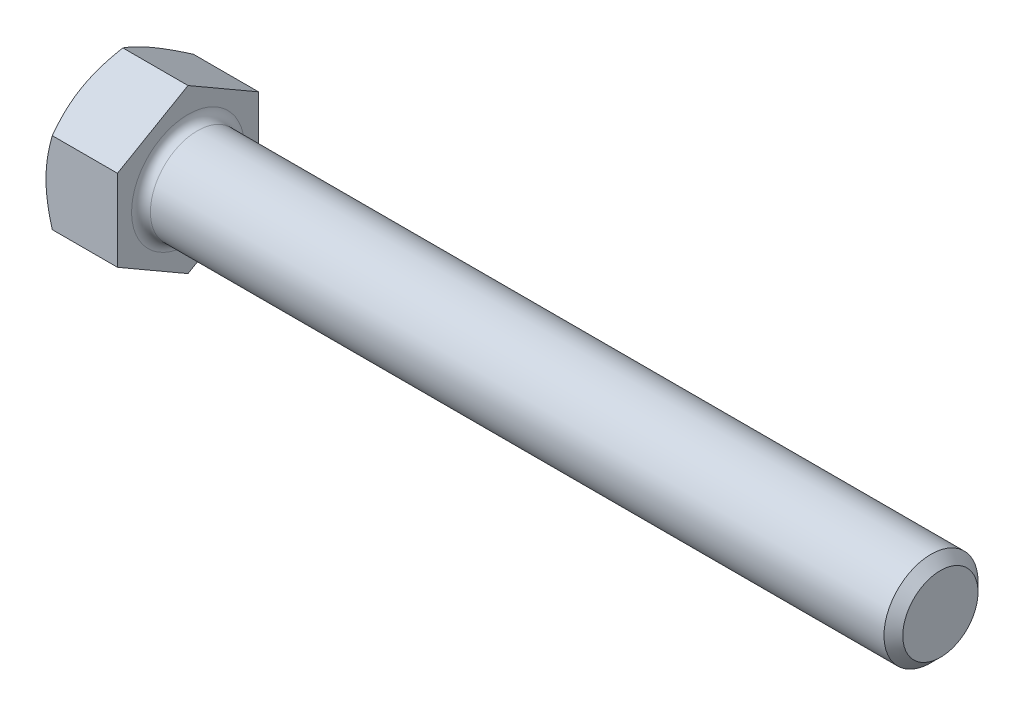
ISO-10303-21;
HEADER;
FILE_DESCRIPTION(('STEP AP214'),'2;1');
FILE_NAME('part.step','',(''),(''),'','','');
FILE_SCHEMA(('AUTOMOTIVE_DESIGN { 1 0 10303 214 1 1 1 1 }'));
ENDSEC;
DATA;
#1=APPLICATION_CONTEXT('core data for automotive mechanical design processes');
#2=APPLICATION_PROTOCOL_DEFINITION('international standard','automotive_design',2000,#1);
#3=PRODUCT_CONTEXT('',#1,'mechanical');
#4=PRODUCT('Part','Part','',(#3));
#5=PRODUCT_RELATED_PRODUCT_CATEGORY('part','',(#4));
#6=PRODUCT_DEFINITION_FORMATION('','',#4);
#7=PRODUCT_DEFINITION_CONTEXT('part definition',#1,'design');
#8=PRODUCT_DEFINITION('design','',#6,#7);
#9=PRODUCT_DEFINITION_SHAPE('','',#8);
#10=(LENGTH_UNIT() NAMED_UNIT(*) SI_UNIT(.MILLI.,.METRE.));
#11=(NAMED_UNIT(*) PLANE_ANGLE_UNIT() SI_UNIT($,.RADIAN.));
#12=(NAMED_UNIT(*) SI_UNIT($,.STERADIAN.) SOLID_ANGLE_UNIT());
#13=UNCERTAINTY_MEASURE_WITH_UNIT(LENGTH_MEASURE(1.E-05),#10,'distance_accuracy_value','');
#14=(GEOMETRIC_REPRESENTATION_CONTEXT(3) GLOBAL_UNCERTAINTY_ASSIGNED_CONTEXT((#13)) GLOBAL_UNIT_ASSIGNED_CONTEXT((#10,
#11,#12)) REPRESENTATION_CONTEXT('',''));
#15=CARTESIAN_POINT('',(0.,0.,0.));
#16=DIRECTION('',(0.,0.,1.));
#17=DIRECTION('',(1.,0.,0.));
#18=AXIS2_PLACEMENT_3D('',#15,#16,#17);
#19=CARTESIAN_POINT('',(-4.826,2.74963065701559,-4.7625));
#20=DIRECTION('',(0.,-0.866025403784439,0.499999999999999));
#21=DIRECTION('',(0.,-0.5,-0.866025403784439));
#22=AXIS2_PLACEMENT_3D('',#19,#20,#21);
#23=PLANE('',#22);
#24=CARTESIAN_POINT('',(-4.40056398824924,5.49937678408502,0.000200000000005412));
#25=CARTESIAN_POINT('',(-4.47034638758606,5.37853889601657,-0.209097361613873));
#26=CARTESIAN_POINT('',(-4.53381673538478,5.25666747870888,-0.420184848381223));
#27=CARTESIAN_POINT('',(-4.64460480393128,5.01081433128269,-0.846014990924108));
#28=CARTESIAN_POINT('',(-4.69188333457021,4.88682823299882,-1.060765212584));
#29=CARTESIAN_POINT('',(-4.76546647463122,4.64037371706653,-1.48763695593352));
#30=CARTESIAN_POINT('',(-4.79226120779827,4.5179436811604,-1.69969199849541));
#31=CARTESIAN_POINT('',(-4.81628887781912,4.33386795649884,-2.01852050604929));
#32=CARTESIAN_POINT('',(-4.82160535899069,4.27246738882597,-2.12486940887228));
#33=CARTESIAN_POINT('',(-4.8267598365683,4.1496095068933,-2.33766550248997));
#34=CARTESIAN_POINT('',(-4.82659800219079,4.08815219444488,-2.44411269014726));
#35=CARTESIAN_POINT('',(-4.81861505017809,3.9197756106675,-2.73574948805455));
#36=CARTESIAN_POINT('',(-4.80520757951211,3.81291212955969,-2.92084246680696));
#37=CARTESIAN_POINT('',(-4.76269213715631,3.59989441060936,-3.28979997894136));
#38=CARTESIAN_POINT('',(-4.7335696317199,3.49374092153974,-3.47366321541066));
#39=CARTESIAN_POINT('',(-4.6607707464131,3.28029401006835,-3.84336411079776));
#40=CARTESIAN_POINT('',(-4.61678588695335,3.17302752682367,-4.02915510972678));
#41=CARTESIAN_POINT('',(-4.51695772006118,2.96009430473234,-4.39796626900832));
#42=CARTESIAN_POINT('',(-4.46113786532195,2.85442483842812,-4.5809911534559));
#43=CARTESIAN_POINT('',(-4.40056398824924,2.74951518696175,-4.7627));
#44=B_SPLINE_CURVE_WITH_KNOTS('',3,(#24,#25,#26,#27,#28,#29,#30,#31,#32,#33,#34,#35,#36,#37,#38,
#39,#40,#41,#42,#43),.UNSPECIFIED.,.F.,.F.,(4,2,2,2,2,2,2,2,2,4),(0.,0.754910190012916,
1.51163483480638,2.24963134670894,2.61827336240839,2.9869039913527,3.62867423192249,
4.27103902109236,4.92765153591996,5.58297484368455),.UNSPECIFIED.);
#45=CARTESIAN_POINT('',(-4.4006306570156,5.49926131403118,0.));
#46=VERTEX_POINT('',#45);
#47=CARTESIAN_POINT('',(-4.826,4.12444598552339,-2.38124999999999));
#48=VERTEX_POINT('',#47);
#49=EDGE_CURVE('E112',#46,#48,#44,.T.);
#50=ORIENTED_EDGE('',*,*,#49,.F.);
#51=DIRECTION('',(1.,0.,0.));
#52=VECTOR('',#51,1.);
#53=CARTESIAN_POINT('',(-4.826,5.49926131403118,0.));
#54=LINE('',#53,#52);
#55=CARTESIAN_POINT('',(0.,5.49926131403118,0.));
#56=VERTEX_POINT('',#55);
#57=EDGE_CURVE('E125',#46,#56,#54,.T.);
#58=ORIENTED_EDGE('',*,*,#57,.T.);
#59=DIRECTION('',(0.,-0.5,-0.866025403784439));
#60=VECTOR('',#59,1.);
#61=CARTESIAN_POINT('',(0.,2.74963065701559,-4.7625));
#62=LINE('',#61,#60);
#63=CARTESIAN_POINT('',(0.,2.74963065701559,-4.7625));
#64=VERTEX_POINT('',#63);
#65=EDGE_CURVE('E129',#56,#64,#62,.T.);
#66=ORIENTED_EDGE('',*,*,#65,.T.);
#67=DIRECTION('',(1.,0.,0.));
#68=VECTOR('',#67,1.);
#69=CARTESIAN_POINT('',(-4.826,2.74963065701559,-4.7625));
#70=LINE('',#69,#68);
#71=CARTESIAN_POINT('',(-4.4006306570156,2.74963065701559,-4.7625));
#72=VERTEX_POINT('',#71);
#73=EDGE_CURVE('E148',#72,#64,#70,.T.);
#74=ORIENTED_EDGE('',*,*,#73,.F.);
#75=EDGE_CURVE('E128',#48,#72,#44,.T.);
#76=ORIENTED_EDGE('',*,*,#75,.F.);
#77=EDGE_LOOP('',(#50,#58,#66,#74,#76));
#78=FACE_BOUND('',#77,.T.);
#79=ADVANCED_FACE('F36',(#78),#23,.F.);
#80=CARTESIAN_POINT('',(-4.826,-2.74963065701559,-4.7625));
#81=DIRECTION('',(0.,0.,1.));
#82=DIRECTION('',(0.,-1.,0.));
#83=AXIS2_PLACEMENT_3D('',#80,#81,#82);
#84=PLANE('',#83);
#85=CARTESIAN_POINT('',(-2.53865492995422,-7.30971731156661,-4.7625));
#86=CARTESIAN_POINT('',(-2.63894582516318,-7.10233411794664,-4.7625));
#87=CARTESIAN_POINT('',(-2.73825279152594,-6.89446659321094,-4.7625));
#88=CARTESIAN_POINT('',(-2.93434388978706,-6.47750501700678,-4.7625));
#89=CARTESIAN_POINT('',(-3.03112760832201,-6.26841077136273,-4.7625));
#90=CARTESIAN_POINT('',(-3.22212058726197,-5.84762353880586,-4.7625));
#91=CARTESIAN_POINT('',(-3.31631227627624,-5.63592254799053,-4.7625));
#92=CARTESIAN_POINT('',(-3.50073783411751,-5.2108098706162,-4.7625));
#93=CARTESIAN_POINT('',(-3.59097189530315,-4.99739826779835,-4.7625));
#94=CARTESIAN_POINT('',(-3.76913037535412,-4.56193618326943,-4.7625));
#95=CARTESIAN_POINT('',(-3.85689893159286,-4.33982157619656,-4.7625));
#96=CARTESIAN_POINT('',(-4.02560705643309,-3.89296573863796,-4.7625));
#97=CARTESIAN_POINT('',(-4.10654584809015,-3.6682242126196,-4.7625));
#98=CARTESIAN_POINT('',(-4.25941364359694,-3.21620296888463,-4.7625));
#99=CARTESIAN_POINT('',(-4.33136156692013,-2.98892971583964,-4.7625));
#100=CARTESIAN_POINT('',(-4.46388883392356,-2.53112455985058,-4.7625));
#101=CARTESIAN_POINT('',(-4.52447184026846,-2.30059373259607,-4.7625));
#102=CARTESIAN_POINT('',(-4.6309943175041,-1.83740766983983,-4.7625));
#103=CARTESIAN_POINT('',(-4.67701029190918,-1.60477036374114,-4.7625));
#104=CARTESIAN_POINT('',(-4.75174576579707,-1.13668440796651,-4.7625));
#105=CARTESIAN_POINT('',(-4.78046675134188,-0.901236001606197,-4.7625));
#106=CARTESIAN_POINT('',(-4.81794377379008,-0.431746037216489,-4.7625));
#107=CARTESIAN_POINT('',(-4.82695039796689,-0.197724985343648,-4.7625));
#108=CARTESIAN_POINT('',(-4.82489021390358,0.270245165970698,-4.7625));
#109=CARTESIAN_POINT('',(-4.81382285651618,0.504194263268692,-4.7625));
#110=CARTESIAN_POINT('',(-4.77855727161905,0.903673507099814,-4.7625));
#111=CARTESIAN_POINT('',(-4.75901888428981,1.06963824347709,-4.7625));
#112=CARTESIAN_POINT('',(-4.71109832669434,1.4002949446895,-4.7625));
#113=CARTESIAN_POINT('',(-4.68271488786702,1.56498672348217,-4.7625));
#114=CARTESIAN_POINT('',(-4.58579509515289,2.05696621832222,-4.7625));
#115=CARTESIAN_POINT('',(-4.50550882608358,2.38196188542261,-4.7625));
#116=CARTESIAN_POINT('',(-4.36703014941268,2.86781398854699,-4.7625));
#117=CARTESIAN_POINT('',(-4.31723714803653,3.03120713132935,-4.7625));
#118=CARTESIAN_POINT('',(-4.21266440559822,3.35640511661037,-4.7625));
#119=CARTESIAN_POINT('',(-4.15788463273706,3.51820994897361,-4.7625));
#120=CARTESIAN_POINT('',(-4.04420190764095,3.84028616885704,-4.7625));
#121=CARTESIAN_POINT('',(-3.9853004369361,4.00055808407178,-4.7625));
#122=CARTESIAN_POINT('',(-3.86404874825557,4.31978669318692,-4.7625));
#123=CARTESIAN_POINT('',(-3.80169856215817,4.47874339922889,-4.7625));
#124=CARTESIAN_POINT('',(-3.65635700460677,4.8396055882017,-4.7625));
#125=CARTESIAN_POINT('',(-3.57245322794143,5.04114279911414,-4.7625));
#126=CARTESIAN_POINT('',(-3.40089342493739,5.44261795808367,-4.7625));
#127=CARTESIAN_POINT('',(-3.31323721756385,5.64255582842752,-4.76249999999999));
#128=CARTESIAN_POINT('',(-3.13488930867042,6.04110971320488,-4.76249999999999));
#129=CARTESIAN_POINT('',(-3.04419710529245,6.23972550252466,-4.76249999999999));
#130=CARTESIAN_POINT('',(-2.86034980666286,6.63581552297746,-4.76249999999999));
#131=CARTESIAN_POINT('',(-2.76719466563982,6.83328973281206,-4.76249999999999));
#132=CARTESIAN_POINT('',(-2.48455741628422,7.42461069797956,-4.76249999999999));
#133=CARTESIAN_POINT('',(-2.29205806653975,7.817014673705,-4.76249999999999));
#134=CARTESIAN_POINT('',(-1.90151383619552,8.5990520506164,-4.76249999999999));
#135=CARTESIAN_POINT('',(-1.70346877205877,8.98868535956997,-4.76249999999999));
#136=CARTESIAN_POINT('',(-1.31897377005232,9.7356118369776,-4.76249999999999));
#137=CARTESIAN_POINT('',(-1.13282282853607,10.093059202551,-4.76249999999999));
#138=CARTESIAN_POINT('',(-0.75794689692703,10.8066127209674,-4.76249999999999));
#139=CARTESIAN_POINT('',(-0.569221831900088,11.1627188343791,-4.76249999999999));
#140=CARTESIAN_POINT('',(-0.190210631481143,11.8730921528281,-4.76249999999999));
#141=CARTESIAN_POINT('',(7.11576984302486E-05,12.2273616797313,-4.76249999999999));
#142=CARTESIAN_POINT('',(0.382198882261842,12.9350341524318,-4.76249999999999));
#143=CARTESIAN_POINT('',(0.574044740694436,13.2884371397628,-4.76249999999999));
#144=CARTESIAN_POINT('',(0.766479229564005,13.6415169914972,-4.76249999999999));
#145=B_SPLINE_CURVE_WITH_KNOTS('',3,(#85,#86,#87,#88,#89,#90,#91,#92,#93,#94,#95,#96,#97,#98,
#99,#100,#101,#102,#103,#104,#105,#106,#107,#108,#109,#110,#111,#112,#113,#114,#115,#116,#117,
#118,#119,#120,#121,#122,#123,#124,#125,#126,#127,#128,#129,#130,#131,#132,#133,#134,#135,#136,
#137,#138,#139,#140,#141,#142,#143,#144),.UNSPECIFIED.,.F.,.F.,(4,2,2,2,2,2,2,2,2,2,2,2,2,2,2,2,
2,2,2,2,2,2,2,2,2,2,2,2,2,4),(0.,0.691090929530282,1.38229437243686,2.07739107275608,
2.77245395070163,3.48884745798766,4.20532235163324,4.92026322857102,5.63497329833932,
6.3458650497355,7.05669570944579,7.75843728919175,8.46019806619033,8.96128606484996,
9.46244596286593,10.4653546355007,10.9777490611263,11.4901467543507,12.0023612047988,
12.514570921371,13.1694362862203,13.8243332805291,14.4793390708444,15.1343570424044,
16.4455162651803,17.7567189325479,18.9657490980689,20.1748145345615,21.3812208217427,
22.5875681084214),.UNSPECIFIED.);
#146=CARTESIAN_POINT('',(-4.826,0.,-4.7625));
#147=VERTEX_POINT('',#146);
#148=EDGE_CURVE('E194',#72,#147,#145,.F.);
#149=ORIENTED_EDGE('',*,*,#148,.F.);
#150=ORIENTED_EDGE('',*,*,#73,.T.);
#151=DIRECTION('',(0.,-1.,0.));
#152=VECTOR('',#151,1.);
#153=CARTESIAN_POINT('',(0.,-2.74963065701559,-4.7625));
#154=LINE('',#153,#152);
#155=CARTESIAN_POINT('',(0.,-2.74963065701559,-4.7625));
#156=VERTEX_POINT('',#155);
#157=EDGE_CURVE('E404',#64,#156,#154,.T.);
#158=ORIENTED_EDGE('',*,*,#157,.T.);
#159=DIRECTION('',(1.,0.,0.));
#160=VECTOR('',#159,1.);
#161=CARTESIAN_POINT('',(-4.826,-2.74963065701559,-4.7625));
#162=LINE('',#161,#160);
#163=CARTESIAN_POINT('',(-4.4006306570156,-2.74963065701559,-4.7625));
#164=VERTEX_POINT('',#163);
#165=EDGE_CURVE('E146',#164,#156,#162,.T.);
#166=ORIENTED_EDGE('',*,*,#165,.F.);
#167=EDGE_CURVE('E195',#147,#164,#145,.F.);
#168=ORIENTED_EDGE('',*,*,#167,.F.);
#169=EDGE_LOOP('',(#149,#150,#158,#166,#168));
#170=FACE_BOUND('',#169,.T.);
#171=ADVANCED_FACE('F174',(#170),#84,.F.);
#172=CARTESIAN_POINT('',(-4.826,-5.49926131403118,0.));
#173=DIRECTION('',(0.,0.866025403784438,0.5));
#174=DIRECTION('',(0.,-0.5,0.866025403784438));
#175=AXIS2_PLACEMENT_3D('',#172,#173,#174);
#176=PLANE('',#175);
#177=CARTESIAN_POINT('',(-4.40056398824924,-2.74951518696175,-4.7627));
#178=CARTESIAN_POINT('',(-4.47034638758606,-2.8703530750302,-4.55340263838612));
#179=CARTESIAN_POINT('',(-4.53381673538478,-2.99222449233789,-4.34231515161877));
#180=CARTESIAN_POINT('',(-4.64460480393128,-3.23807763976409,-3.91648500907589));
#181=CARTESIAN_POINT('',(-4.69188333457021,-3.36206373804796,-3.701734787416));
#182=CARTESIAN_POINT('',(-4.76546647463122,-3.60851825398025,-3.27486304406647));
#183=CARTESIAN_POINT('',(-4.79226120779828,-3.73094828988637,-3.06280800150458));
#184=CARTESIAN_POINT('',(-4.81628887781913,-3.91502401454793,-2.7439794939507));
#185=CARTESIAN_POINT('',(-4.82160535899069,-3.9764245822208,-2.63763059112772));
#186=CARTESIAN_POINT('',(-4.8267598365683,-4.09928246415348,-2.42483449751002));
#187=CARTESIAN_POINT('',(-4.8265980021908,-4.16073977660189,-2.31838730985274));
#188=CARTESIAN_POINT('',(-4.81861505017809,-4.32911636037927,-2.02675051194544));
#189=CARTESIAN_POINT('',(-4.80520757951211,-4.43597984148708,-1.84165753319303));
#190=CARTESIAN_POINT('',(-4.76269213715631,-4.64899756043742,-1.47270002105863));
#191=CARTESIAN_POINT('',(-4.7335696317199,-4.75515104950704,-1.28883678458933));
#192=CARTESIAN_POINT('',(-4.6607707464131,-4.96859796097843,-0.919135889202235));
#193=CARTESIAN_POINT('',(-4.61678588695335,-5.07586444422311,-0.733344890273215));
#194=CARTESIAN_POINT('',(-4.51695772006118,-5.28879766631444,-0.364533730991681));
#195=CARTESIAN_POINT('',(-4.46113786532195,-5.39446713261865,-0.181508846544095));
#196=CARTESIAN_POINT('',(-4.40056398824924,-5.49937678408502,0.000199999999996878));
#197=B_SPLINE_CURVE_WITH_KNOTS('',3,(#177,#178,#179,#180,#181,#182,#183,#184,#185,#186,#187,
#188,#189,#190,#191,#192,#193,#194,#195,#196),.UNSPECIFIED.,.F.,.F.,(4,2,2,2,2,2,2,2,2,4),(0.,
0.754910190012916,1.51163483480638,2.24963134670895,2.61827336240839,2.9869039913527,
3.62867423192249,4.27103902109236,4.92765153591996,5.58297484368455),.UNSPECIFIED.);
#198=CARTESIAN_POINT('',(-4.826,-4.12444598552338,-2.38125));
#199=VERTEX_POINT('',#198);
#200=EDGE_CURVE('E233',#164,#199,#197,.T.);
#201=ORIENTED_EDGE('',*,*,#200,.F.);
#202=ORIENTED_EDGE('',*,*,#165,.T.);
#203=DIRECTION('',(0.,-0.5,0.866025403784438));
#204=VECTOR('',#203,1.);
#205=CARTESIAN_POINT('',(0.,-5.49926131403118,0.));
#206=LINE('',#205,#204);
#207=CARTESIAN_POINT('',(0.,-5.49926131403118,0.));
#208=VERTEX_POINT('',#207);
#209=EDGE_CURVE('E405',#156,#208,#206,.T.);
#210=ORIENTED_EDGE('',*,*,#209,.T.);
#211=DIRECTION('',(1.,0.,0.));
#212=VECTOR('',#211,1.);
#213=CARTESIAN_POINT('',(-4.826,-5.49926131403118,0.));
#214=LINE('',#213,#212);
#215=CARTESIAN_POINT('',(-4.4006306570156,-5.49926131403118,0.));
#216=VERTEX_POINT('',#215);
#217=EDGE_CURVE('E144',#216,#208,#214,.T.);
#218=ORIENTED_EDGE('',*,*,#217,.F.);
#219=EDGE_CURVE('E229',#199,#216,#197,.T.);
#220=ORIENTED_EDGE('',*,*,#219,.F.);
#221=EDGE_LOOP('',(#201,#202,#210,#218,#220));
#222=FACE_BOUND('',#221,.T.);
#223=ADVANCED_FACE('F179',(#222),#176,.F.);
#224=CARTESIAN_POINT('',(-4.826,-2.7496306570156,4.7625));
#225=DIRECTION('',(0.,0.866025403784439,-0.499999999999999));
#226=DIRECTION('',(0.,0.499999999999999,0.866025403784439));
#227=AXIS2_PLACEMENT_3D('',#224,#225,#226);
#228=PLANE('',#227);
#229=CARTESIAN_POINT('',(-4.40056398824924,-5.49937678408502,-0.000200000000003331));
#230=CARTESIAN_POINT('',(-4.47034638758606,-5.37853889601657,0.209097361613875));
#231=CARTESIAN_POINT('',(-4.53381673538478,-5.25666747870888,0.420184848381226));
#232=CARTESIAN_POINT('',(-4.64460480393128,-5.01081433128269,0.846014990924112));
#233=CARTESIAN_POINT('',(-4.69188333457021,-4.88682823299882,1.060765212584));
#234=CARTESIAN_POINT('',(-4.76546647463122,-4.64037371706653,1.48763695593353));
#235=CARTESIAN_POINT('',(-4.79226120779828,-4.5179436811604,1.69969199849541));
#236=CARTESIAN_POINT('',(-4.81628887781913,-4.33386795649884,2.0185205060493));
#237=CARTESIAN_POINT('',(-4.82160535899069,-4.27246738882597,2.12486940887228));
#238=CARTESIAN_POINT('',(-4.8267598365683,-4.1496095068933,2.33766550248998));
#239=CARTESIAN_POINT('',(-4.8265980021908,-4.08815219444488,2.44411269014726));
#240=CARTESIAN_POINT('',(-4.81861505017809,-3.9197756106675,2.73574948805456));
#241=CARTESIAN_POINT('',(-4.80520757951211,-3.81291212955969,2.92084246680697));
#242=CARTESIAN_POINT('',(-4.76269213715631,-3.59989441060936,3.28979997894137));
#243=CARTESIAN_POINT('',(-4.7335696317199,-3.49374092153974,3.47366321541067));
#244=CARTESIAN_POINT('',(-4.6607707464131,-3.28029401006835,3.84336411079776));
#245=CARTESIAN_POINT('',(-4.61678588695335,-3.17302752682367,4.02915510972678));
#246=CARTESIAN_POINT('',(-4.51695772006118,-2.96009430473234,4.39796626900832));
#247=CARTESIAN_POINT('',(-4.46113786532195,-2.85442483842813,4.5809911534559));
#248=CARTESIAN_POINT('',(-4.40056398824924,-2.74951518696176,4.7627));
#249=B_SPLINE_CURVE_WITH_KNOTS('',3,(#229,#230,#231,#232,#233,#234,#235,#236,#237,#238,#239,
#240,#241,#242,#243,#244,#245,#246,#247,#248),.UNSPECIFIED.,.F.,.F.,(4,2,2,2,2,2,2,2,2,4),(0.,
0.754910190012917,1.51163483480638,2.24963134670895,2.61827336240839,2.9869039913527,
3.62867423192249,4.27103902109236,4.92765153591996,5.58297484368455),.UNSPECIFIED.);
#250=CARTESIAN_POINT('',(-4.826,-4.12444598552339,2.38125));
#251=VERTEX_POINT('',#250);
#252=EDGE_CURVE('E59',#216,#251,#249,.T.);
#253=ORIENTED_EDGE('',*,*,#252,.F.);
#254=ORIENTED_EDGE('',*,*,#217,.T.);
#255=DIRECTION('',(0.,0.499999999999999,0.866025403784439));
#256=VECTOR('',#255,1.);
#257=CARTESIAN_POINT('',(0.,-2.7496306570156,4.7625));
#258=LINE('',#257,#256);
#259=CARTESIAN_POINT('',(0.,-2.7496306570156,4.7625));
#260=VERTEX_POINT('',#259);
#261=EDGE_CURVE('E401',#208,#260,#258,.T.);
#262=ORIENTED_EDGE('',*,*,#261,.T.);
#263=DIRECTION('',(1.,0.,0.));
#264=VECTOR('',#263,1.);
#265=CARTESIAN_POINT('',(-4.826,-2.7496306570156,4.7625));
#266=LINE('',#265,#264);
#267=CARTESIAN_POINT('',(-4.4006306570156,-2.7496306570156,4.7625));
#268=VERTEX_POINT('',#267);
#269=EDGE_CURVE('E137',#268,#260,#266,.T.);
#270=ORIENTED_EDGE('',*,*,#269,.F.);
#271=EDGE_CURVE('E224',#251,#268,#249,.T.);
#272=ORIENTED_EDGE('',*,*,#271,.F.);
#273=EDGE_LOOP('',(#253,#254,#262,#270,#272));
#274=FACE_BOUND('',#273,.T.);
#275=ADVANCED_FACE('F236',(#274),#228,.F.);
#276=CARTESIAN_POINT('',(-4.826,2.74963065701559,4.7625));
#277=DIRECTION('',(0.,0.,-1.));
#278=DIRECTION('',(0.,1.,0.));
#279=AXIS2_PLACEMENT_3D('',#276,#277,#278);
#280=PLANE('',#279);
#281=CARTESIAN_POINT('',(-2.53865492995422,-7.30971731156661,4.76249999999999));
#282=CARTESIAN_POINT('',(-2.63894582516318,-7.10233411794665,4.76249999999999));
#283=CARTESIAN_POINT('',(-2.73825279152594,-6.89446659321094,4.76249999999999));
#284=CARTESIAN_POINT('',(-2.93434388978706,-6.47750501700678,4.76249999999999));
#285=CARTESIAN_POINT('',(-3.03112760832201,-6.26841077136274,4.76249999999999));
#286=CARTESIAN_POINT('',(-3.22212058726197,-5.84762353880587,4.76249999999999));
#287=CARTESIAN_POINT('',(-3.31631227627624,-5.63592254799054,4.76249999999999));
#288=CARTESIAN_POINT('',(-3.50073783411751,-5.21080987061621,4.76249999999999));
#289=CARTESIAN_POINT('',(-3.59097189530315,-4.99739826779836,4.76249999999999));
#290=CARTESIAN_POINT('',(-3.76913037535412,-4.56193618326944,4.76249999999999));
#291=CARTESIAN_POINT('',(-3.85689893159286,-4.33982157619657,4.76249999999999));
#292=CARTESIAN_POINT('',(-4.02560705643309,-3.89296573863797,4.76249999999999));
#293=CARTESIAN_POINT('',(-4.10654584809015,-3.6682242126196,4.76249999999999));
#294=CARTESIAN_POINT('',(-4.25941364359694,-3.21620296888463,4.76249999999999));
#295=CARTESIAN_POINT('',(-4.33136156692013,-2.98892971583965,4.7625));
#296=CARTESIAN_POINT('',(-4.46388883392356,-2.53112455985059,4.7625));
#297=CARTESIAN_POINT('',(-4.52447184026846,-2.30059373259607,4.7625));
#298=CARTESIAN_POINT('',(-4.6309943175041,-1.83740766983984,4.7625));
#299=CARTESIAN_POINT('',(-4.67701029190918,-1.60477036374115,4.7625));
#300=CARTESIAN_POINT('',(-4.75174576579707,-1.13668440796652,4.7625));
#301=CARTESIAN_POINT('',(-4.78046675134188,-0.901236001606206,4.7625));
#302=CARTESIAN_POINT('',(-4.81794377379008,-0.431746037216497,4.7625));
#303=CARTESIAN_POINT('',(-4.82695039796689,-0.197724985343655,4.7625));
#304=CARTESIAN_POINT('',(-4.82489021390358,0.270245165970691,4.7625));
#305=CARTESIAN_POINT('',(-4.81382285651618,0.504194263268686,4.7625));
#306=CARTESIAN_POINT('',(-4.77855727161905,0.903673507099808,4.7625));
#307=CARTESIAN_POINT('',(-4.75901888428981,1.06963824347708,4.7625));
#308=CARTESIAN_POINT('',(-4.71109832669434,1.40029494468949,4.7625));
#309=CARTESIAN_POINT('',(-4.68271488786702,1.56498672348216,4.7625));
#310=CARTESIAN_POINT('',(-4.58579509515289,2.05696621832221,4.7625));
#311=CARTESIAN_POINT('',(-4.50550882608357,2.3819618854226,4.7625));
#312=CARTESIAN_POINT('',(-4.36703014941267,2.86781398854699,4.7625));
#313=CARTESIAN_POINT('',(-4.31723714803653,3.03120713132935,4.7625));
#314=CARTESIAN_POINT('',(-4.21266440559822,3.35640511661037,4.7625));
#315=CARTESIAN_POINT('',(-4.15788463273706,3.5182099489736,4.7625));
#316=CARTESIAN_POINT('',(-4.04420190764094,3.84028616885704,4.7625));
#317=CARTESIAN_POINT('',(-3.98530043693609,4.00055808407178,4.7625));
#318=CARTESIAN_POINT('',(-3.86404874825556,4.31978669318692,4.7625));
#319=CARTESIAN_POINT('',(-3.80169856215817,4.47874339922889,4.7625));
#320=CARTESIAN_POINT('',(-3.65635700460677,4.8396055882017,4.7625));
#321=CARTESIAN_POINT('',(-3.57245322794143,5.04114279911414,4.7625));
#322=CARTESIAN_POINT('',(-3.40089342493739,5.44261795808366,4.7625));
#323=CARTESIAN_POINT('',(-3.31323721756385,5.64255582842751,4.7625));
#324=CARTESIAN_POINT('',(-3.13488930867042,6.04110971320488,4.7625));
#325=CARTESIAN_POINT('',(-3.04419710529245,6.23972550252465,4.7625));
#326=CARTESIAN_POINT('',(-2.86034980666286,6.63581552297746,4.7625));
#327=CARTESIAN_POINT('',(-2.76719466563982,6.83328973281205,4.76250000000001));
#328=CARTESIAN_POINT('',(-2.48455741628422,7.42461069797955,4.76250000000001));
#329=CARTESIAN_POINT('',(-2.29205806653975,7.81701467370499,4.76250000000001));
#330=CARTESIAN_POINT('',(-1.90151383619552,8.5990520506164,4.76250000000001));
#331=CARTESIAN_POINT('',(-1.70346877205876,8.98868535956997,4.76250000000001));
#332=CARTESIAN_POINT('',(-1.31897377005232,9.7356118369776,4.76250000000001));
#333=CARTESIAN_POINT('',(-1.13282282853607,10.093059202551,4.76250000000001));
#334=CARTESIAN_POINT('',(-0.757946896927029,10.8066127209674,4.76250000000001));
#335=CARTESIAN_POINT('',(-0.569221831900086,11.162718834379,4.76250000000001));
#336=CARTESIAN_POINT('',(-0.190210631481141,11.8730921528281,4.76250000000001));
#337=CARTESIAN_POINT('',(7.11576984315497E-05,12.2273616797313,4.76250000000001));
#338=CARTESIAN_POINT('',(0.382198882261843,12.9350341524318,4.76250000000001));
#339=CARTESIAN_POINT('',(0.574044740694438,13.2884371397628,4.76250000000001));
#340=CARTESIAN_POINT('',(0.766479229564007,13.6415169914972,4.76250000000001));
#341=B_SPLINE_CURVE_WITH_KNOTS('',3,(#281,#282,#283,#284,#285,#286,#287,#288,#289,#290,#291,
#292,#293,#294,#295,#296,#297,#298,#299,#300,#301,#302,#303,#304,#305,#306,#307,#308,#309,#310,
#311,#312,#313,#314,#315,#316,#317,#318,#319,#320,#321,#322,#323,#324,#325,#326,#327,#328,#329,
#330,#331,#332,#333,#334,#335,#336,#337,#338,#339,#340),.UNSPECIFIED.,.F.,.F.,(4,2,2,2,2,2,2,2,
2,2,2,2,2,2,2,2,2,2,2,2,2,2,2,2,2,2,2,2,2,4),(0.,0.691090929530282,1.38229437243686,
2.07739107275608,2.77245395070163,3.48884745798766,4.20532235163324,4.92026322857102,
5.63497329833932,6.3458650497355,7.05669570944579,7.75843728919175,8.46019806619033,
8.96128606484995,9.46244596286593,10.4653546355007,10.9777490611263,11.4901467543506,
12.0023612047988,12.514570921371,13.1694362862203,13.8243332805291,14.4793390708444,
15.1343570424044,16.4455162651803,17.7567189325479,18.9657490980689,20.1748145345615,
21.3812208217427,22.5875681084214),.UNSPECIFIED.);
#342=CARTESIAN_POINT('',(-4.826,0.,4.7625));
#343=VERTEX_POINT('',#342);
#344=EDGE_CURVE('E51',#268,#343,#341,.T.);
#345=ORIENTED_EDGE('',*,*,#344,.F.);
#346=ORIENTED_EDGE('',*,*,#269,.T.);
#347=DIRECTION('',(0.,1.,0.));
#348=VECTOR('',#347,1.);
#349=CARTESIAN_POINT('',(0.,2.74963065701559,4.7625));
#350=LINE('',#349,#348);
#351=CARTESIAN_POINT('',(0.,2.74963065701559,4.7625));
#352=VERTEX_POINT('',#351);
#353=EDGE_CURVE('E139',#260,#352,#350,.T.);
#354=ORIENTED_EDGE('',*,*,#353,.T.);
#355=DIRECTION('',(1.,0.,0.));
#356=VECTOR('',#355,1.);
#357=CARTESIAN_POINT('',(-4.826,2.74963065701559,4.7625));
#358=LINE('',#357,#356);
#359=CARTESIAN_POINT('',(-4.4006306570156,2.74963065701559,4.7625));
#360=VERTEX_POINT('',#359);
#361=EDGE_CURVE('E135',#360,#352,#358,.T.);
#362=ORIENTED_EDGE('',*,*,#361,.F.);
#363=EDGE_CURVE('E217',#343,#360,#341,.T.);
#364=ORIENTED_EDGE('',*,*,#363,.F.);
#365=EDGE_LOOP('',(#345,#346,#354,#362,#364));
#366=FACE_BOUND('',#365,.T.);
#367=ADVANCED_FACE('F240',(#366),#280,.F.);
#368=CARTESIAN_POINT('',(-4.826,5.49926131403118,0.));
#369=DIRECTION('',(0.,-0.866025403784438,-0.500000000000001));
#370=DIRECTION('',(0.,0.500000000000001,-0.866025403784438));
#371=AXIS2_PLACEMENT_3D('',#368,#369,#370);
#372=PLANE('',#371);
#373=CARTESIAN_POINT('',(-4.40056398824924,2.74951518696175,4.7627));
#374=CARTESIAN_POINT('',(-4.47034638758606,2.8703530750302,4.55340263838612));
#375=CARTESIAN_POINT('',(-4.53381673538478,2.99222449233789,4.34231515161877));
#376=CARTESIAN_POINT('',(-4.64460480393128,3.23807763976408,3.91648500907589));
#377=CARTESIAN_POINT('',(-4.69188333457021,3.36206373804795,3.701734787416));
#378=CARTESIAN_POINT('',(-4.76546647463122,3.60851825398025,3.27486304406647));
#379=CARTESIAN_POINT('',(-4.79226120779827,3.73094828988637,3.06280800150459));
#380=CARTESIAN_POINT('',(-4.81628887781912,3.91502401454793,2.74397949395071));
#381=CARTESIAN_POINT('',(-4.82160535899069,3.9764245822208,2.63763059112772));
#382=CARTESIAN_POINT('',(-4.82675983656829,4.09928246415348,2.42483449751003));
#383=CARTESIAN_POINT('',(-4.82659800219079,4.16073977660189,2.31838730985274));
#384=CARTESIAN_POINT('',(-4.81861505017809,4.32911636037927,2.02675051194544));
#385=CARTESIAN_POINT('',(-4.80520757951211,4.43597984148708,1.84165753319304));
#386=CARTESIAN_POINT('',(-4.76269213715631,4.64899756043741,1.47270002105863));
#387=CARTESIAN_POINT('',(-4.7335696317199,4.75515104950704,1.28883678458934));
#388=CARTESIAN_POINT('',(-4.6607707464131,4.96859796097843,0.919135889202237));
#389=CARTESIAN_POINT('',(-4.61678588695335,5.07586444422311,0.733344890273217));
#390=CARTESIAN_POINT('',(-4.51695772006118,5.28879766631444,0.364533730991683));
#391=CARTESIAN_POINT('',(-4.46113786532195,5.39446713261865,0.181508846544097));
#392=CARTESIAN_POINT('',(-4.40056398824924,5.49937678408502,-0.000199999999994659));
#393=B_SPLINE_CURVE_WITH_KNOTS('',3,(#373,#374,#375,#376,#377,#378,#379,#380,#381,#382,#383,
#384,#385,#386,#387,#388,#389,#390,#391,#392),.UNSPECIFIED.,.F.,.F.,(4,2,2,2,2,2,2,2,2,4),(0.,
0.754910190012917,1.51163483480638,2.24963134670895,2.61827336240839,2.9869039913527,
3.62867423192249,4.27103902109236,4.92765153591996,5.58297484368455),.UNSPECIFIED.);
#394=CARTESIAN_POINT('',(-4.826,4.12444598552339,2.38125));
#395=VERTEX_POINT('',#394);
#396=EDGE_CURVE('E119',#360,#395,#393,.T.);
#397=ORIENTED_EDGE('',*,*,#396,.F.);
#398=ORIENTED_EDGE('',*,*,#361,.T.);
#399=DIRECTION('',(0.,0.500000000000001,-0.866025403784438));
#400=VECTOR('',#399,1.);
#401=CARTESIAN_POINT('',(0.,5.49926131403118,0.));
#402=LINE('',#401,#400);
#403=EDGE_CURVE('E133',#352,#56,#402,.T.);
#404=ORIENTED_EDGE('',*,*,#403,.T.);
#405=ORIENTED_EDGE('',*,*,#57,.F.);
#406=EDGE_CURVE('E109',#395,#46,#393,.T.);
#407=ORIENTED_EDGE('',*,*,#406,.F.);
#408=EDGE_LOOP('',(#397,#398,#404,#405,#407));
#409=FACE_BOUND('',#408,.T.);
#410=ADVANCED_FACE('F131',(#409),#372,.F.);
#411=CARTESIAN_POINT('',(50.8,0.,0.));
#412=DIRECTION('',(1.,0.,0.));
#413=DIRECTION('',(0.,1.,0.));
#414=AXIS2_PLACEMENT_3D('',#411,#412,#413);
#415=PLANE('',#414);
#416=CARTESIAN_POINT('',(50.8,0.,0.));
#417=DIRECTION('',(1.,0.,0.));
#418=DIRECTION('',(0.,1.,0.));
#419=AXIS2_PLACEMENT_3D('',#416,#417,#418);
#420=CIRCLE('',#419,2.53990000000001);
#421=CARTESIAN_POINT('',(50.8,2.53990000000002,0.));
#422=VERTEX_POINT('',#421);
#423=EDGE_CURVE('E153',#422,#422,#420,.T.);
#424=ORIENTED_EDGE('',*,*,#423,.T.);
#425=EDGE_LOOP('',(#424));
#426=FACE_BOUND('',#425,.T.);
#427=ADVANCED_FACE('F247',(#426),#415,.T.);
#428=CARTESIAN_POINT('',(50.8,0.,0.));
#429=DIRECTION('',(1.,0.,0.));
#430=DIRECTION('',(0.,1.,0.));
#431=AXIS2_PLACEMENT_3D('',#428,#429,#430);
#432=CYLINDRICAL_SURFACE('',#431,3.175);
#433=CARTESIAN_POINT('',(0.634999999999997,0.,0.));
#434=DIRECTION('',(1.,0.,0.));
#435=DIRECTION('',(0.,1.,0.));
#436=AXIS2_PLACEMENT_3D('',#433,#434,#435);
#437=CIRCLE('',#436,3.175);
#438=CARTESIAN_POINT('',(0.634999999999996,3.175,0.));
#439=VERTEX_POINT('',#438);
#440=EDGE_CURVE('E11',#439,#439,#437,.T.);
#441=ORIENTED_EDGE('',*,*,#440,.T.);
#442=EDGE_LOOP('',(#441));
#443=FACE_BOUND('',#442,.T.);
#444=CARTESIAN_POINT('',(50.165,0.,0.));
#445=DIRECTION('',(1.,0.,0.));
#446=DIRECTION('',(0.,1.,0.));
#447=AXIS2_PLACEMENT_3D('',#444,#445,#446);
#448=CIRCLE('',#447,3.175);
#449=CARTESIAN_POINT('',(50.165,3.17500000000001,0.));
#450=VERTEX_POINT('',#449);
#451=EDGE_CURVE('E156',#450,#450,#448,.F.);
#452=ORIENTED_EDGE('',*,*,#451,.T.);
#453=EDGE_LOOP('',(#452));
#454=FACE_BOUND('',#453,.T.);
#455=ADVANCED_FACE('F186',(#443,#454),#432,.T.);
#456=CARTESIAN_POINT('',(0.,0.,0.));
#457=DIRECTION('',(1.,0.,0.));
#458=DIRECTION('',(0.,1.,0.));
#459=AXIS2_PLACEMENT_3D('',#456,#457,#458);
#460=PLANE('',#459);
#461=CARTESIAN_POINT('',(0.,0.,0.));
#462=DIRECTION('',(1.,0.,0.));
#463=DIRECTION('',(0.,1.,0.));
#464=AXIS2_PLACEMENT_3D('',#461,#462,#463);
#465=CIRCLE('',#464,3.81);
#466=CARTESIAN_POINT('',(0.,3.81,0.));
#467=VERTEX_POINT('',#466);
#468=EDGE_CURVE('E44',#467,#467,#465,.F.);
#469=ORIENTED_EDGE('',*,*,#468,.T.);
#470=EDGE_LOOP('',(#469));
#471=FACE_BOUND('',#470,.T.);
#472=ORIENTED_EDGE('',*,*,#65,.F.);
#473=ORIENTED_EDGE('',*,*,#403,.F.);
#474=ORIENTED_EDGE('',*,*,#353,.F.);
#475=ORIENTED_EDGE('',*,*,#261,.F.);
#476=ORIENTED_EDGE('',*,*,#209,.F.);
#477=ORIENTED_EDGE('',*,*,#157,.F.);
#478=EDGE_LOOP('',(#472,#473,#474,#475,#476,#477));
#479=FACE_BOUND('',#478,.T.);
#480=ADVANCED_FACE('F161',(#471,#479),#460,.T.);
#481=CARTESIAN_POINT('',(-4.826,0.,0.));
#482=DIRECTION('',(1.,0.,0.));
#483=DIRECTION('',(0.,1.,0.));
#484=AXIS2_PLACEMENT_3D('',#481,#482,#483);
#485=CONICAL_SURFACE('',#484,4.7625,1.0471975511966);
#486=ORIENTED_EDGE('',*,*,#49,.T.);
#487=CARTESIAN_POINT('',(-4.826,0.,0.));
#488=DIRECTION('',(1.,0.,0.));
#489=DIRECTION('',(0.,1.,0.));
#490=AXIS2_PLACEMENT_3D('',#487,#488,#489);
#491=CIRCLE('',#490,4.7625);
#492=EDGE_CURVE('E114',#48,#395,#491,.T.);
#493=ORIENTED_EDGE('',*,*,#492,.T.);
#494=ORIENTED_EDGE('',*,*,#406,.T.);
#495=EDGE_LOOP('',(#486,#493,#494));
#496=FACE_BOUND('',#495,.T.);
#497=ADVANCED_FACE('F111',(#496),#485,.T.);
#498=ORIENTED_EDGE('',*,*,#75,.T.);
#499=ORIENTED_EDGE('',*,*,#148,.T.);
#500=EDGE_CURVE('E151',#147,#48,#491,.T.);
#501=ORIENTED_EDGE('',*,*,#500,.T.);
#502=EDGE_LOOP('',(#498,#499,#501));
#503=FACE_BOUND('',#502,.T.);
#504=ADVANCED_FACE('F204',(#503),#485,.T.);
#505=ORIENTED_EDGE('',*,*,#167,.T.);
#506=ORIENTED_EDGE('',*,*,#200,.T.);
#507=EDGE_CURVE('E383',#199,#147,#491,.T.);
#508=ORIENTED_EDGE('',*,*,#507,.T.);
#509=EDGE_LOOP('',(#505,#506,#508));
#510=FACE_BOUND('',#509,.T.);
#511=ADVANCED_FACE('F304',(#510),#485,.T.);
#512=ORIENTED_EDGE('',*,*,#219,.T.);
#513=ORIENTED_EDGE('',*,*,#252,.T.);
#514=EDGE_CURVE('E382',#251,#199,#491,.T.);
#515=ORIENTED_EDGE('',*,*,#514,.T.);
#516=EDGE_LOOP('',(#512,#513,#515));
#517=FACE_BOUND('',#516,.T.);
#518=ADVANCED_FACE('F312',(#517),#485,.T.);
#519=ORIENTED_EDGE('',*,*,#271,.T.);
#520=ORIENTED_EDGE('',*,*,#344,.T.);
#521=CARTESIAN_POINT('',(-4.826,0.,0.));
#522=DIRECTION('',(-1.,0.,0.));
#523=DIRECTION('',(0.,-1.,0.));
#524=AXIS2_PLACEMENT_3D('',#521,#522,#523);
#525=CIRCLE('',#524,4.7625);
#526=EDGE_CURVE('E120',#251,#343,#525,.T.);
#527=ORIENTED_EDGE('',*,*,#526,.F.);
#528=EDGE_LOOP('',(#519,#520,#527));
#529=FACE_BOUND('',#528,.T.);
#530=ADVANCED_FACE('F320',(#529),#485,.T.);
#531=ORIENTED_EDGE('',*,*,#363,.T.);
#532=ORIENTED_EDGE('',*,*,#396,.T.);
#533=EDGE_CURVE('E152',#395,#343,#491,.T.);
#534=ORIENTED_EDGE('',*,*,#533,.T.);
#535=EDGE_LOOP('',(#531,#532,#534));
#536=FACE_BOUND('',#535,.T.);
#537=ADVANCED_FACE('F205',(#536),#485,.T.);
#538=CARTESIAN_POINT('',(-4.826,0.,0.));
#539=DIRECTION('',(1.,0.,0.));
#540=DIRECTION('',(0.,1.,0.));
#541=AXIS2_PLACEMENT_3D('',#538,#539,#540);
#542=PLANE('',#541);
#543=ORIENTED_EDGE('',*,*,#533,.F.);
#544=ORIENTED_EDGE('',*,*,#492,.F.);
#545=ORIENTED_EDGE('',*,*,#500,.F.);
#546=ORIENTED_EDGE('',*,*,#507,.F.);
#547=ORIENTED_EDGE('',*,*,#514,.F.);
#548=ORIENTED_EDGE('',*,*,#526,.T.);
#549=EDGE_LOOP('',(#543,#544,#545,#546,#547,#548));
#550=FACE_BOUND('',#549,.T.);
#551=ADVANCED_FACE('F170',(#550),#542,.F.);
#552=CARTESIAN_POINT('',(50.8,0.,0.));
#553=DIRECTION('',(-1.,0.,0.));
#554=DIRECTION('',(0.,-1.,0.));
#555=AXIS2_PLACEMENT_3D('',#552,#553,#554);
#556=CONICAL_SURFACE('',#555,2.53990000000001,0.785476897355242);
#557=ORIENTED_EDGE('',*,*,#451,.F.);
#558=EDGE_LOOP('',(#557));
#559=FACE_BOUND('',#558,.T.);
#560=ORIENTED_EDGE('',*,*,#423,.F.);
#561=EDGE_LOOP('',(#560));
#562=FACE_BOUND('',#561,.T.);
#563=ADVANCED_FACE('F165',(#559,#562),#556,.T.);
#564=CARTESIAN_POINT('',(0.634999999999997,0.,0.));
#565=DIRECTION('',(1.,0.,0.));
#566=DIRECTION('',(0.,1.,0.));
#567=AXIS2_PLACEMENT_3D('',#564,#565,#566);
#568=TOROIDAL_SURFACE('',#567,3.81,0.635);
#569=ORIENTED_EDGE('',*,*,#440,.F.);
#570=EDGE_LOOP('',(#569));
#571=FACE_BOUND('',#570,.T.);
#572=ORIENTED_EDGE('',*,*,#468,.F.);
#573=EDGE_LOOP('',(#572));
#574=FACE_BOUND('',#573,.T.);
#575=ADVANCED_FACE('F38',(#571,#574),#568,.F.);
#576=CLOSED_SHELL('',(#79,#171,#223,#275,#367,#410,#427,#455,#480,#497,#504,#511,#518,#530,#537,
#551,#563,#575));
#577=MANIFOLD_SOLID_BREP('B2',#576);
#578=ADVANCED_BREP_SHAPE_REPRESENTATION('',(#18,#577),#14);
#579=SHAPE_DEFINITION_REPRESENTATION(#9,#578);
ENDSEC;
END-ISO-10303-21;
